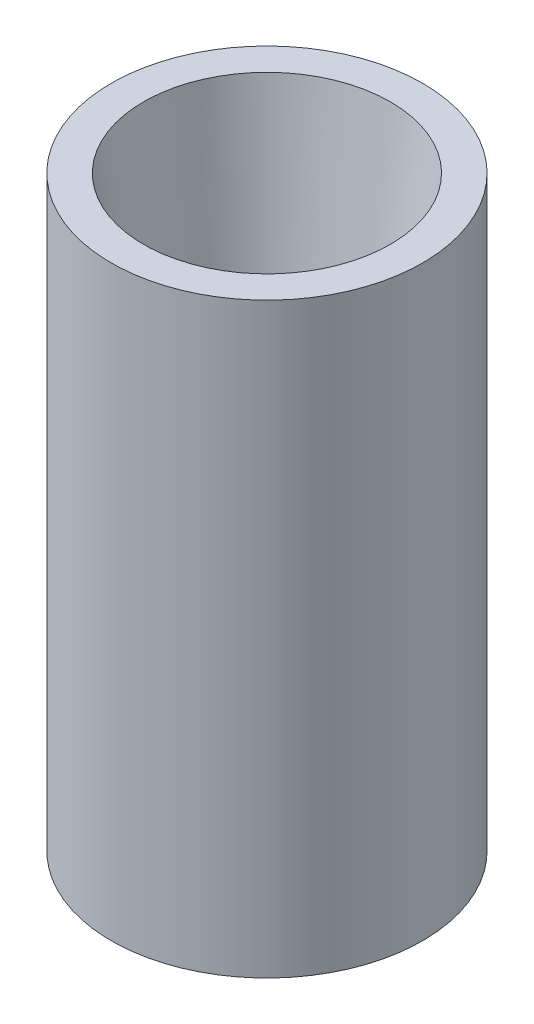
ISO-10303-21;
HEADER;
FILE_DESCRIPTION(('STEP AP214'),'2;1');
FILE_NAME('part.step','',(''),(''),'','','');
FILE_SCHEMA(('AUTOMOTIVE_DESIGN { 1 0 10303 214 1 1 1 1 }'));
ENDSEC;
DATA;
#1=APPLICATION_CONTEXT('core data for automotive mechanical design processes');
#2=APPLICATION_PROTOCOL_DEFINITION('international standard','automotive_design',2000,#1);
#3=PRODUCT_CONTEXT('',#1,'mechanical');
#4=PRODUCT('Part','Part','',(#3));
#5=PRODUCT_RELATED_PRODUCT_CATEGORY('part','',(#4));
#6=PRODUCT_DEFINITION_FORMATION('','',#4);
#7=PRODUCT_DEFINITION_CONTEXT('part definition',#1,'design');
#8=PRODUCT_DEFINITION('design','',#6,#7);
#9=PRODUCT_DEFINITION_SHAPE('','',#8);
#10=(LENGTH_UNIT() NAMED_UNIT(*) SI_UNIT(.MILLI.,.METRE.));
#11=(NAMED_UNIT(*) PLANE_ANGLE_UNIT() SI_UNIT($,.RADIAN.));
#12=(NAMED_UNIT(*) SI_UNIT($,.STERADIAN.) SOLID_ANGLE_UNIT());
#13=UNCERTAINTY_MEASURE_WITH_UNIT(LENGTH_MEASURE(1.E-05),#10,'distance_accuracy_value','');
#14=(GEOMETRIC_REPRESENTATION_CONTEXT(3) GLOBAL_UNCERTAINTY_ASSIGNED_CONTEXT((#13)) GLOBAL_UNIT_ASSIGNED_CONTEXT((#10,
#11,#12)) REPRESENTATION_CONTEXT('',''));
#15=CARTESIAN_POINT('',(0.,0.,0.));
#16=DIRECTION('',(0.,0.,1.));
#17=DIRECTION('',(1.,0.,0.));
#18=AXIS2_PLACEMENT_3D('',#15,#16,#17);
#19=CARTESIAN_POINT('',(-18.034,2.,0.));
#20=DIRECTION('',(0.,1.,0.));
#21=DIRECTION('',(0.,0.,1.));
#22=AXIS2_PLACEMENT_3D('',#19,#20,#21);
#23=PLANE('',#22);
#24=CARTESIAN_POINT('',(0.,2.,0.));
#25=DIRECTION('',(0.,-1.,0.));
#26=DIRECTION('',(0.,0.,-1.));
#27=AXIS2_PLACEMENT_3D('',#24,#25,#26);
#28=CIRCLE('',#27,18.034);
#29=CARTESIAN_POINT('',(0.,2.,-18.034));
#30=VERTEX_POINT('',#29);
#31=EDGE_CURVE('E74',#30,#30,#28,.T.);
#32=ORIENTED_EDGE('',*,*,#31,.T.);
#33=EDGE_LOOP('',(#32));
#34=FACE_BOUND('',#33,.T.);
#35=ADVANCED_FACE('F43',(#34),#23,.F.);
#36=CARTESIAN_POINT('',(-20.5,5.,0.));
#37=DIRECTION('',(0.,-1.,0.));
#38=DIRECTION('',(0.,0.,-1.));
#39=AXIS2_PLACEMENT_3D('',#36,#37,#38);
#40=PLANE('',#39);
#41=CARTESIAN_POINT('',(0.,5.,0.));
#42=DIRECTION('',(0.,-1.,0.));
#43=DIRECTION('',(0.,0.,-1.));
#44=AXIS2_PLACEMENT_3D('',#41,#42,#43);
#45=CIRCLE('',#44,20.5);
#46=CARTESIAN_POINT('',(0.,5.,-20.5));
#47=VERTEX_POINT('',#46);
#48=EDGE_CURVE('E10',#47,#47,#45,.T.);
#49=ORIENTED_EDGE('',*,*,#48,.F.);
#50=EDGE_LOOP('',(#49));
#51=FACE_BOUND('',#50,.T.);
#52=ADVANCED_FACE('F111',(#51),#40,.F.);
#53=CARTESIAN_POINT('',(0.,0.,0.));
#54=DIRECTION('',(0.,-1.,0.));
#55=DIRECTION('',(0.,0.,-1.));
#56=AXIS2_PLACEMENT_3D('',#53,#54,#55);
#57=CYLINDRICAL_SURFACE('',#56,20.5);
#58=CARTESIAN_POINT('',(0.,55.,0.));
#59=DIRECTION('',(0.,-1.,0.));
#60=DIRECTION('',(0.,0.,-1.));
#61=AXIS2_PLACEMENT_3D('',#58,#59,#60);
#62=CIRCLE('',#61,20.5);
#63=CARTESIAN_POINT('',(0.,55.,-20.5));
#64=VERTEX_POINT('',#63);
#65=EDGE_CURVE('E50',#64,#64,#62,.T.);
#66=ORIENTED_EDGE('',*,*,#65,.F.);
#67=EDGE_LOOP('',(#66));
#68=FACE_BOUND('',#67,.T.);
#69=ORIENTED_EDGE('',*,*,#48,.T.);
#70=EDGE_LOOP('',(#69));
#71=FACE_BOUND('',#70,.T.);
#72=ADVANCED_FACE('F106',(#68,#71),#57,.F.);
#73=CARTESIAN_POINT('',(0.,55.,0.));
#74=DIRECTION('',(0.,1.,0.));
#75=DIRECTION('',(0.,0.,1.));
#76=AXIS2_PLACEMENT_3D('',#73,#74,#75);
#77=CONICAL_SURFACE('',#76,20.5,0.136344373121932);
#78=CARTESIAN_POINT('',(0.,157.04410811017,0.));
#79=DIRECTION('',(0.,-1.,0.));
#80=DIRECTION('',(0.,0.,-1.));
#81=AXIS2_PLACEMENT_3D('',#78,#79,#80);
#82=CIRCLE('',#81,34.5);
#83=CARTESIAN_POINT('',(0.,157.04410811017,-34.5));
#84=VERTEX_POINT('',#83);
#85=EDGE_CURVE('E55',#84,#84,#82,.T.);
#86=ORIENTED_EDGE('',*,*,#85,.F.);
#87=EDGE_LOOP('',(#86));
#88=FACE_BOUND('',#87,.T.);
#89=ORIENTED_EDGE('',*,*,#65,.T.);
#90=EDGE_LOOP('',(#89));
#91=FACE_BOUND('',#90,.T.);
#92=ADVANCED_FACE('F101',(#88,#91),#77,.F.);
#93=CARTESIAN_POINT('',(-43.5,157.04410811017,0.));
#94=DIRECTION('',(0.,-1.,0.));
#95=DIRECTION('',(0.,0.,-1.));
#96=AXIS2_PLACEMENT_3D('',#93,#94,#95);
#97=PLANE('',#96);
#98=CARTESIAN_POINT('',(0.,157.04410811017,0.));
#99=DIRECTION('',(0.,-1.,0.));
#100=DIRECTION('',(0.,0.,-1.));
#101=AXIS2_PLACEMENT_3D('',#98,#99,#100);
#102=CIRCLE('',#101,43.5);
#103=CARTESIAN_POINT('',(0.,157.04410811017,-43.5));
#104=VERTEX_POINT('',#103);
#105=EDGE_CURVE('E60',#104,#104,#102,.T.);
#106=ORIENTED_EDGE('',*,*,#105,.F.);
#107=EDGE_LOOP('',(#106));
#108=FACE_BOUND('',#107,.T.);
#109=ORIENTED_EDGE('',*,*,#85,.T.);
#110=EDGE_LOOP('',(#109));
#111=FACE_BOUND('',#110,.T.);
#112=ADVANCED_FACE('F95',(#108,#111),#97,.F.);
#113=CARTESIAN_POINT('',(0.,0.,0.));
#114=DIRECTION('',(0.,-1.,0.));
#115=DIRECTION('',(0.,0.,-1.));
#116=AXIS2_PLACEMENT_3D('',#113,#114,#115);
#117=CYLINDRICAL_SURFACE('',#116,43.5);
#118=CARTESIAN_POINT('',(0.,-7.,0.));
#119=DIRECTION('',(0.,-1.,0.));
#120=DIRECTION('',(0.,0.,-1.));
#121=AXIS2_PLACEMENT_3D('',#118,#119,#120);
#122=CIRCLE('',#121,43.5);
#123=CARTESIAN_POINT('',(0.,-7.,-43.5));
#124=VERTEX_POINT('',#123);
#125=EDGE_CURVE('E66',#124,#124,#122,.T.);
#126=ORIENTED_EDGE('',*,*,#125,.F.);
#127=EDGE_LOOP('',(#126));
#128=FACE_BOUND('',#127,.T.);
#129=ORIENTED_EDGE('',*,*,#105,.T.);
#130=EDGE_LOOP('',(#129));
#131=FACE_BOUND('',#130,.T.);
#132=ADVANCED_FACE('F89',(#128,#131),#117,.T.);
#133=CARTESIAN_POINT('',(-18.034,-7.,0.));
#134=DIRECTION('',(0.,1.,0.));
#135=DIRECTION('',(0.,0.,1.));
#136=AXIS2_PLACEMENT_3D('',#133,#134,#135);
#137=PLANE('',#136);
#138=CARTESIAN_POINT('',(0.,-7.,0.));
#139=DIRECTION('',(0.,-1.,0.));
#140=DIRECTION('',(0.,0.,-1.));
#141=AXIS2_PLACEMENT_3D('',#138,#139,#140);
#142=CIRCLE('',#141,18.034);
#143=CARTESIAN_POINT('',(0.,-7.,-18.034));
#144=VERTEX_POINT('',#143);
#145=EDGE_CURVE('E70',#144,#144,#142,.T.);
#146=ORIENTED_EDGE('',*,*,#145,.F.);
#147=EDGE_LOOP('',(#146));
#148=FACE_BOUND('',#147,.T.);
#149=ORIENTED_EDGE('',*,*,#125,.T.);
#150=EDGE_LOOP('',(#149));
#151=FACE_BOUND('',#150,.T.);
#152=ADVANCED_FACE('F83',(#148,#151),#137,.F.);
#153=CARTESIAN_POINT('',(0.,0.,0.));
#154=DIRECTION('',(0.,-1.,0.));
#155=DIRECTION('',(0.,0.,-1.));
#156=AXIS2_PLACEMENT_3D('',#153,#154,#155);
#157=CYLINDRICAL_SURFACE('',#156,18.034);
#158=ORIENTED_EDGE('',*,*,#31,.F.);
#159=EDGE_LOOP('',(#158));
#160=FACE_BOUND('',#159,.T.);
#161=ORIENTED_EDGE('',*,*,#145,.T.);
#162=EDGE_LOOP('',(#161));
#163=FACE_BOUND('',#162,.T.);
#164=ADVANCED_FACE('F80',(#160,#163),#157,.F.);
#165=CLOSED_SHELL('',(#35,#52,#72,#92,#112,#132,#152,#164));
#166=MANIFOLD_SOLID_BREP('B2',#165);
#167=ADVANCED_BREP_SHAPE_REPRESENTATION('',(#18,#166),#14);
#168=SHAPE_DEFINITION_REPRESENTATION(#9,#167);
ENDSEC;
END-ISO-10303-21;
